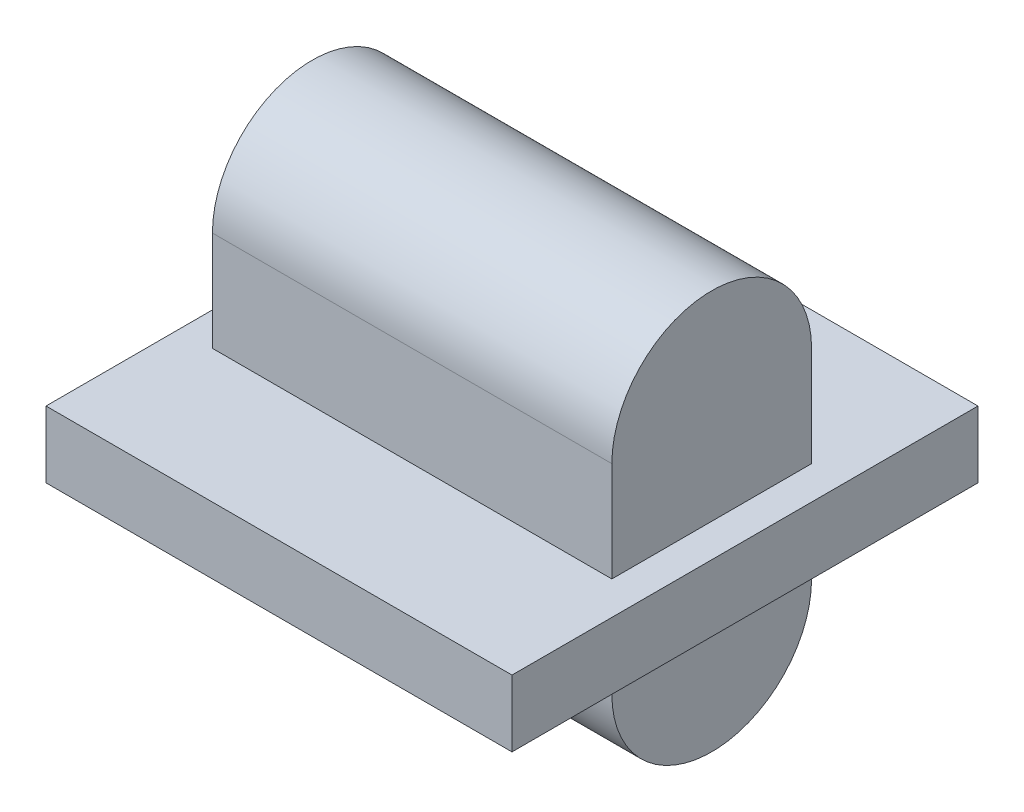
ISO-10303-21;
HEADER;
FILE_DESCRIPTION(('STEP AP214'),'2;1');
FILE_NAME('part.step','',(''),(''),'','','');
FILE_SCHEMA(('AUTOMOTIVE_DESIGN { 1 0 10303 214 1 1 1 1 }'));
ENDSEC;
DATA;
#1=APPLICATION_CONTEXT('core data for automotive mechanical design processes');
#2=APPLICATION_PROTOCOL_DEFINITION('international standard','automotive_design',2000,#1);
#3=PRODUCT_CONTEXT('',#1,'mechanical');
#4=PRODUCT('Part','Part','',(#3));
#5=PRODUCT_RELATED_PRODUCT_CATEGORY('part','',(#4));
#6=PRODUCT_DEFINITION_FORMATION('','',#4);
#7=PRODUCT_DEFINITION_CONTEXT('part definition',#1,'design');
#8=PRODUCT_DEFINITION('design','',#6,#7);
#9=PRODUCT_DEFINITION_SHAPE('','',#8);
#10=(LENGTH_UNIT() NAMED_UNIT(*) SI_UNIT(.MILLI.,.METRE.));
#11=(NAMED_UNIT(*) PLANE_ANGLE_UNIT() SI_UNIT($,.RADIAN.));
#12=(NAMED_UNIT(*) SI_UNIT($,.STERADIAN.) SOLID_ANGLE_UNIT());
#13=UNCERTAINTY_MEASURE_WITH_UNIT(LENGTH_MEASURE(1.E-05),#10,'distance_accuracy_value','');
#14=(GEOMETRIC_REPRESENTATION_CONTEXT(3) GLOBAL_UNCERTAINTY_ASSIGNED_CONTEXT((#13)) GLOBAL_UNIT_ASSIGNED_CONTEXT((#10,
#11,#12)) REPRESENTATION_CONTEXT('',''));
#15=CARTESIAN_POINT('',(0.,0.,0.));
#16=DIRECTION('',(0.,0.,1.));
#17=DIRECTION('',(1.,0.,0.));
#18=AXIS2_PLACEMENT_3D('',#15,#16,#17);
#19=CARTESIAN_POINT('',(-88.9000000000001,12.7,88.9));
#20=DIRECTION('',(1.,0.,0.));
#21=DIRECTION('',(0.,0.,-1.));
#22=AXIS2_PLACEMENT_3D('',#19,#20,#21);
#23=PLANE('',#22);
#24=DIRECTION('',(0.,0.,1.));
#25=VECTOR('',#24,1.);
#26=CARTESIAN_POINT('',(-88.9000000000001,-12.7,88.9));
#27=LINE('',#26,#25);
#28=CARTESIAN_POINT('',(-88.9000000000001,-12.7,-88.9));
#29=VERTEX_POINT('',#28);
#30=CARTESIAN_POINT('',(-88.9000000000001,-12.7,88.9));
#31=VERTEX_POINT('',#30);
#32=EDGE_CURVE('E163',#29,#31,#27,.T.);
#33=ORIENTED_EDGE('',*,*,#32,.T.);
#34=DIRECTION('',(0.,-1.,0.));
#35=VECTOR('',#34,1.);
#36=CARTESIAN_POINT('',(-88.9000000000001,12.7,88.9));
#37=LINE('',#36,#35);
#38=CARTESIAN_POINT('',(-88.9000000000001,12.7,88.9));
#39=VERTEX_POINT('',#38);
#40=EDGE_CURVE('E190',#39,#31,#37,.T.);
#41=ORIENTED_EDGE('',*,*,#40,.F.);
#42=DIRECTION('',(0.,0.,1.));
#43=VECTOR('',#42,1.);
#44=CARTESIAN_POINT('',(-88.9000000000001,12.7,88.9));
#45=LINE('',#44,#43);
#46=CARTESIAN_POINT('',(-88.9000000000001,12.7,-88.9));
#47=VERTEX_POINT('',#46);
#48=EDGE_CURVE('E164',#47,#39,#45,.T.);
#49=ORIENTED_EDGE('',*,*,#48,.F.);
#50=DIRECTION('',(0.,-1.,0.));
#51=VECTOR('',#50,1.);
#52=CARTESIAN_POINT('',(-88.9000000000001,12.7,-88.9));
#53=LINE('',#52,#51);
#54=EDGE_CURVE('E174',#47,#29,#53,.T.);
#55=ORIENTED_EDGE('',*,*,#54,.T.);
#56=EDGE_LOOP('',(#33,#41,#49,#55));
#57=FACE_BOUND('',#56,.T.);
#58=ADVANCED_FACE('F35',(#57),#23,.F.);
#59=CARTESIAN_POINT('',(88.8999999999999,12.7,88.8999999999999));
#60=DIRECTION('',(0.,0.,-1.));
#61=DIRECTION('',(-1.,0.,0.));
#62=AXIS2_PLACEMENT_3D('',#59,#60,#61);
#63=PLANE('',#62);
#64=DIRECTION('',(1.,0.,0.));
#65=VECTOR('',#64,1.);
#66=CARTESIAN_POINT('',(88.8999999999999,-12.7,88.8999999999999));
#67=LINE('',#66,#65);
#68=CARTESIAN_POINT('',(88.8999999999999,-12.7,88.8999999999999));
#69=VERTEX_POINT('',#68);
#70=EDGE_CURVE('E177',#31,#69,#67,.T.);
#71=ORIENTED_EDGE('',*,*,#70,.T.);
#72=DIRECTION('',(0.,-1.,0.));
#73=VECTOR('',#72,1.);
#74=CARTESIAN_POINT('',(88.8999999999999,12.7,88.8999999999999));
#75=LINE('',#74,#73);
#76=CARTESIAN_POINT('',(88.8999999999999,12.7,88.8999999999999));
#77=VERTEX_POINT('',#76);
#78=EDGE_CURVE('E187',#77,#69,#75,.T.);
#79=ORIENTED_EDGE('',*,*,#78,.F.);
#80=DIRECTION('',(1.,0.,0.));
#81=VECTOR('',#80,1.);
#82=CARTESIAN_POINT('',(88.8999999999999,12.7,88.8999999999999));
#83=LINE('',#82,#81);
#84=EDGE_CURVE('E167',#39,#77,#83,.T.);
#85=ORIENTED_EDGE('',*,*,#84,.F.);
#86=ORIENTED_EDGE('',*,*,#40,.T.);
#87=EDGE_LOOP('',(#71,#79,#85,#86));
#88=FACE_BOUND('',#87,.T.);
#89=ADVANCED_FACE('F246',(#88),#63,.F.);
#90=CARTESIAN_POINT('',(88.8999999999999,12.7,88.8999999999999));
#91=DIRECTION('',(-1.,0.,0.));
#92=DIRECTION('',(0.,0.,1.));
#93=AXIS2_PLACEMENT_3D('',#90,#91,#92);
#94=PLANE('',#93);
#95=DIRECTION('',(0.,0.,-1.));
#96=VECTOR('',#95,1.);
#97=CARTESIAN_POINT('',(88.8999999999999,-12.7,88.8999999999999));
#98=LINE('',#97,#96);
#99=CARTESIAN_POINT('',(88.8999999999999,-12.7,-88.9));
#100=VERTEX_POINT('',#99);
#101=EDGE_CURVE('E179',#69,#100,#98,.T.);
#102=ORIENTED_EDGE('',*,*,#101,.T.);
#103=DIRECTION('',(0.,-1.,0.));
#104=VECTOR('',#103,1.);
#105=CARTESIAN_POINT('',(88.8999999999999,12.7,-88.9));
#106=LINE('',#105,#104);
#107=CARTESIAN_POINT('',(88.8999999999999,12.7,-88.9));
#108=VERTEX_POINT('',#107);
#109=EDGE_CURVE('E184',#108,#100,#106,.T.);
#110=ORIENTED_EDGE('',*,*,#109,.F.);
#111=DIRECTION('',(0.,0.,-1.));
#112=VECTOR('',#111,1.);
#113=CARTESIAN_POINT('',(88.8999999999999,12.7,88.8999999999999));
#114=LINE('',#113,#112);
#115=EDGE_CURVE('E170',#77,#108,#114,.T.);
#116=ORIENTED_EDGE('',*,*,#115,.F.);
#117=ORIENTED_EDGE('',*,*,#78,.T.);
#118=EDGE_LOOP('',(#102,#110,#116,#117));
#119=FACE_BOUND('',#118,.T.);
#120=ADVANCED_FACE('F251',(#119),#94,.F.);
#121=CARTESIAN_POINT('',(88.8999999999999,12.7,-88.9));
#122=DIRECTION('',(0.,0.,1.));
#123=DIRECTION('',(1.,0.,0.));
#124=AXIS2_PLACEMENT_3D('',#121,#122,#123);
#125=PLANE('',#124);
#126=DIRECTION('',(-1.,0.,0.));
#127=VECTOR('',#126,1.);
#128=CARTESIAN_POINT('',(88.8999999999999,-12.7,-88.9));
#129=LINE('',#128,#127);
#130=EDGE_CURVE('E168',#100,#29,#129,.T.);
#131=ORIENTED_EDGE('',*,*,#130,.T.);
#132=ORIENTED_EDGE('',*,*,#54,.F.);
#133=DIRECTION('',(-1.,0.,0.));
#134=VECTOR('',#133,1.);
#135=CARTESIAN_POINT('',(88.8999999999999,12.7,-88.9));
#136=LINE('',#135,#134);
#137=EDGE_CURVE('E172',#108,#47,#136,.T.);
#138=ORIENTED_EDGE('',*,*,#137,.F.);
#139=ORIENTED_EDGE('',*,*,#109,.T.);
#140=EDGE_LOOP('',(#131,#132,#138,#139));
#141=FACE_BOUND('',#140,.T.);
#142=ADVANCED_FACE('F266',(#141),#125,.F.);
#143=CARTESIAN_POINT('',(0.,12.7,0.));
#144=DIRECTION('',(0.,1.,0.));
#145=DIRECTION('',(0.,0.,1.));
#146=AXIS2_PLACEMENT_3D('',#143,#144,#145);
#147=PLANE('',#146);
#148=DIRECTION('',(0.,0.,-1.));
#149=VECTOR('',#148,1.);
#150=CARTESIAN_POINT('',(76.2,12.7,0.));
#151=LINE('',#150,#149);
#152=CARTESIAN_POINT('',(76.2,12.7,38.1));
#153=VERTEX_POINT('',#152);
#154=CARTESIAN_POINT('',(76.2,12.7,-38.1));
#155=VERTEX_POINT('',#154);
#156=EDGE_CURVE('E149',#153,#155,#151,.T.);
#157=ORIENTED_EDGE('',*,*,#156,.F.);
#158=DIRECTION('',(-1.,0.,0.));
#159=VECTOR('',#158,1.);
#160=CARTESIAN_POINT('',(0.,12.7,38.1));
#161=LINE('',#160,#159);
#162=CARTESIAN_POINT('',(-76.2,12.7,38.1));
#163=VERTEX_POINT('',#162);
#164=EDGE_CURVE('E157',#153,#163,#161,.T.);
#165=ORIENTED_EDGE('',*,*,#164,.T.);
#166=DIRECTION('',(0.,0.,-1.));
#167=VECTOR('',#166,1.);
#168=CARTESIAN_POINT('',(-76.2,12.7,0.));
#169=LINE('',#168,#167);
#170=CARTESIAN_POINT('',(-76.2,12.7,-38.1));
#171=VERTEX_POINT('',#170);
#172=EDGE_CURVE('E145',#163,#171,#169,.T.);
#173=ORIENTED_EDGE('',*,*,#172,.T.);
#174=DIRECTION('',(1.,0.,0.));
#175=VECTOR('',#174,1.);
#176=CARTESIAN_POINT('',(0.,12.7,-38.1));
#177=LINE('',#176,#175);
#178=EDGE_CURVE('E160',#171,#155,#177,.T.);
#179=ORIENTED_EDGE('',*,*,#178,.T.);
#180=EDGE_LOOP('',(#157,#165,#173,#179));
#181=FACE_BOUND('',#180,.T.);
#182=ORIENTED_EDGE('',*,*,#48,.T.);
#183=ORIENTED_EDGE('',*,*,#84,.T.);
#184=ORIENTED_EDGE('',*,*,#115,.T.);
#185=ORIENTED_EDGE('',*,*,#137,.T.);
#186=EDGE_LOOP('',(#182,#183,#184,#185));
#187=FACE_BOUND('',#186,.T.);
#188=ADVANCED_FACE('F225',(#181,#187),#147,.T.);
#189=CARTESIAN_POINT('',(0.,-12.7,0.));
#190=DIRECTION('',(0.,1.,0.));
#191=DIRECTION('',(0.,0.,1.));
#192=AXIS2_PLACEMENT_3D('',#189,#190,#191);
#193=PLANE('',#192);
#194=DIRECTION('',(-1.,0.,0.));
#195=VECTOR('',#194,1.);
#196=CARTESIAN_POINT('',(0.,-12.7,38.1));
#197=LINE('',#196,#195);
#198=CARTESIAN_POINT('',(76.2,-12.7,38.1));
#199=VERTEX_POINT('',#198);
#200=CARTESIAN_POINT('',(-76.2,-12.7,38.1));
#201=VERTEX_POINT('',#200);
#202=EDGE_CURVE('E196',#199,#201,#197,.T.);
#203=ORIENTED_EDGE('',*,*,#202,.F.);
#204=DIRECTION('',(0.,0.,-1.));
#205=VECTOR('',#204,1.);
#206=CARTESIAN_POINT('',(76.2,-12.7,0.));
#207=LINE('',#206,#205);
#208=CARTESIAN_POINT('',(76.2,-12.7,-38.1));
#209=VERTEX_POINT('',#208);
#210=EDGE_CURVE('E11',#199,#209,#207,.T.);
#211=ORIENTED_EDGE('',*,*,#210,.T.);
#212=DIRECTION('',(1.,0.,0.));
#213=VECTOR('',#212,1.);
#214=CARTESIAN_POINT('',(0.,-12.7,-38.1));
#215=LINE('',#214,#213);
#216=CARTESIAN_POINT('',(-76.2,-12.7,-38.1));
#217=VERTEX_POINT('',#216);
#218=EDGE_CURVE('E42',#217,#209,#215,.T.);
#219=ORIENTED_EDGE('',*,*,#218,.F.);
#220=DIRECTION('',(0.,0.,-1.));
#221=VECTOR('',#220,1.);
#222=CARTESIAN_POINT('',(-76.2,-12.7,0.));
#223=LINE('',#222,#221);
#224=EDGE_CURVE('E193',#201,#217,#223,.T.);
#225=ORIENTED_EDGE('',*,*,#224,.F.);
#226=EDGE_LOOP('',(#203,#211,#219,#225));
#227=FACE_BOUND('',#226,.T.);
#228=ORIENTED_EDGE('',*,*,#32,.F.);
#229=ORIENTED_EDGE('',*,*,#130,.F.);
#230=ORIENTED_EDGE('',*,*,#101,.F.);
#231=ORIENTED_EDGE('',*,*,#70,.F.);
#232=EDGE_LOOP('',(#228,#229,#230,#231));
#233=FACE_BOUND('',#232,.T.);
#234=ADVANCED_FACE('F259',(#227,#233),#193,.F.);
#235=CARTESIAN_POINT('',(76.2,-25.4,0.));
#236=DIRECTION('',(-1.,0.,0.));
#237=DIRECTION('',(0.,0.,1.));
#238=AXIS2_PLACEMENT_3D('',#235,#236,#237);
#239=CYLINDRICAL_SURFACE('',#238,38.1);
#240=CARTESIAN_POINT('',(-76.2,-25.4,0.));
#241=DIRECTION('',(1.,0.,0.));
#242=DIRECTION('',(0.,0.,-1.));
#243=AXIS2_PLACEMENT_3D('',#240,#241,#242);
#244=CIRCLE('',#243,38.1);
#245=CARTESIAN_POINT('',(-76.2,-25.4,38.1));
#246=VERTEX_POINT('',#245);
#247=CARTESIAN_POINT('',(-76.2,-25.4,-38.1));
#248=VERTEX_POINT('',#247);
#249=EDGE_CURVE('E144',#246,#248,#244,.T.);
#250=ORIENTED_EDGE('',*,*,#249,.T.);
#251=DIRECTION('',(-1.,0.,0.));
#252=VECTOR('',#251,1.);
#253=CARTESIAN_POINT('',(76.2,-25.4,-38.1));
#254=LINE('',#253,#252);
#255=CARTESIAN_POINT('',(76.2,-25.4,-38.1));
#256=VERTEX_POINT('',#255);
#257=EDGE_CURVE('E126',#256,#248,#254,.T.);
#258=ORIENTED_EDGE('',*,*,#257,.F.);
#259=CARTESIAN_POINT('',(76.2,-25.4,0.));
#260=DIRECTION('',(1.,0.,0.));
#261=DIRECTION('',(0.,0.,-1.));
#262=AXIS2_PLACEMENT_3D('',#259,#260,#261);
#263=CIRCLE('',#262,38.1);
#264=CARTESIAN_POINT('',(76.2,-25.4,38.1));
#265=VERTEX_POINT('',#264);
#266=EDGE_CURVE('E133',#265,#256,#263,.T.);
#267=ORIENTED_EDGE('',*,*,#266,.F.);
#268=DIRECTION('',(-1.,0.,0.));
#269=VECTOR('',#268,1.);
#270=CARTESIAN_POINT('',(76.2,-25.4,38.1));
#271=LINE('',#270,#269);
#272=EDGE_CURVE('E211',#265,#246,#271,.T.);
#273=ORIENTED_EDGE('',*,*,#272,.T.);
#274=EDGE_LOOP('',(#250,#258,#267,#273));
#275=FACE_BOUND('',#274,.T.);
#276=ADVANCED_FACE('F142',(#275),#239,.T.);
#277=CARTESIAN_POINT('',(-76.2,-25.4,0.));
#278=DIRECTION('',(1.,0.,0.));
#279=DIRECTION('',(0.,0.,-1.));
#280=AXIS2_PLACEMENT_3D('',#277,#278,#279);
#281=PLANE('',#280);
#282=DIRECTION('',(0.,-1.,0.));
#283=VECTOR('',#282,1.);
#284=CARTESIAN_POINT('',(-76.2,-25.4,38.1));
#285=LINE('',#284,#283);
#286=EDGE_CURVE('E201',#201,#246,#285,.T.);
#287=ORIENTED_EDGE('',*,*,#286,.F.);
#288=ORIENTED_EDGE('',*,*,#224,.T.);
#289=DIRECTION('',(0.,1.,0.));
#290=VECTOR('',#289,1.);
#291=CARTESIAN_POINT('',(-76.2,-25.4,-38.1));
#292=LINE('',#291,#290);
#293=EDGE_CURVE('E207',#248,#217,#292,.T.);
#294=ORIENTED_EDGE('',*,*,#293,.F.);
#295=ORIENTED_EDGE('',*,*,#249,.F.);
#296=EDGE_LOOP('',(#287,#288,#294,#295));
#297=FACE_BOUND('',#296,.T.);
#298=ADVANCED_FACE('F203',(#297),#281,.F.);
#299=CARTESIAN_POINT('',(76.2,-25.4,0.));
#300=DIRECTION('',(1.,0.,0.));
#301=DIRECTION('',(0.,0.,-1.));
#302=AXIS2_PLACEMENT_3D('',#299,#300,#301);
#303=PLANE('',#302);
#304=ORIENTED_EDGE('',*,*,#210,.F.);
#305=DIRECTION('',(0.,-1.,0.));
#306=VECTOR('',#305,1.);
#307=CARTESIAN_POINT('',(76.2,-25.4,38.1));
#308=LINE('',#307,#306);
#309=EDGE_CURVE('E136',#199,#265,#308,.T.);
#310=ORIENTED_EDGE('',*,*,#309,.T.);
#311=ORIENTED_EDGE('',*,*,#266,.T.);
#312=DIRECTION('',(0.,1.,0.));
#313=VECTOR('',#312,1.);
#314=CARTESIAN_POINT('',(76.2,-25.4,-38.1));
#315=LINE('',#314,#313);
#316=EDGE_CURVE('E121',#256,#209,#315,.T.);
#317=ORIENTED_EDGE('',*,*,#316,.T.);
#318=EDGE_LOOP('',(#304,#310,#311,#317));
#319=FACE_BOUND('',#318,.T.);
#320=ADVANCED_FACE('F134',(#319),#303,.T.);
#321=CARTESIAN_POINT('',(76.2,-25.4,38.1));
#322=DIRECTION('',(0.,0.,-1.));
#323=DIRECTION('',(-1.,0.,0.));
#324=AXIS2_PLACEMENT_3D('',#321,#322,#323);
#325=PLANE('',#324);
#326=ORIENTED_EDGE('',*,*,#309,.F.);
#327=ORIENTED_EDGE('',*,*,#202,.T.);
#328=ORIENTED_EDGE('',*,*,#286,.T.);
#329=ORIENTED_EDGE('',*,*,#272,.F.);
#330=EDGE_LOOP('',(#326,#327,#328,#329));
#331=FACE_BOUND('',#330,.T.);
#332=ADVANCED_FACE('F200',(#331),#325,.F.);
#333=CARTESIAN_POINT('',(76.2,-25.4,-38.1));
#334=DIRECTION('',(0.,0.,1.));
#335=DIRECTION('',(1.,0.,0.));
#336=AXIS2_PLACEMENT_3D('',#333,#334,#335);
#337=PLANE('',#336);
#338=ORIENTED_EDGE('',*,*,#293,.T.);
#339=ORIENTED_EDGE('',*,*,#218,.T.);
#340=ORIENTED_EDGE('',*,*,#316,.F.);
#341=ORIENTED_EDGE('',*,*,#257,.T.);
#342=EDGE_LOOP('',(#338,#339,#340,#341));
#343=FACE_BOUND('',#342,.T.);
#344=ADVANCED_FACE('F124',(#343),#337,.F.);
#345=ORIENTED_EDGE('',*,*,#178,.F.);
#346=CARTESIAN_POINT('',(-76.2,50.8,-38.1));
#347=VERTEX_POINT('',#346);
#348=EDGE_CURVE('E49',#171,#347,#292,.T.);
#349=ORIENTED_EDGE('',*,*,#348,.T.);
#350=DIRECTION('',(-1.,0.,0.));
#351=VECTOR('',#350,1.);
#352=CARTESIAN_POINT('',(76.2,50.8,-38.1));
#353=LINE('',#352,#351);
#354=CARTESIAN_POINT('',(76.2,50.8,-38.1));
#355=VERTEX_POINT('',#354);
#356=EDGE_CURVE('E146',#355,#347,#353,.T.);
#357=ORIENTED_EDGE('',*,*,#356,.F.);
#358=EDGE_CURVE('E130',#155,#355,#315,.T.);
#359=ORIENTED_EDGE('',*,*,#358,.F.);
#360=EDGE_LOOP('',(#345,#349,#357,#359));
#361=FACE_BOUND('',#360,.T.);
#362=ADVANCED_FACE('F235',(#361),#337,.F.);
#363=CARTESIAN_POINT('',(76.2,50.8,0.));
#364=DIRECTION('',(-1.,0.,0.));
#365=DIRECTION('',(0.,0.,1.));
#366=AXIS2_PLACEMENT_3D('',#363,#364,#365);
#367=CYLINDRICAL_SURFACE('',#366,38.1);
#368=CARTESIAN_POINT('',(-76.2,50.8,0.));
#369=DIRECTION('',(1.,0.,0.));
#370=DIRECTION('',(0.,0.,-1.));
#371=AXIS2_PLACEMENT_3D('',#368,#369,#370);
#372=CIRCLE('',#371,38.1);
#373=CARTESIAN_POINT('',(-76.2,50.8,38.1));
#374=VERTEX_POINT('',#373);
#375=EDGE_CURVE('E204',#347,#374,#372,.T.);
#376=ORIENTED_EDGE('',*,*,#375,.T.);
#377=DIRECTION('',(-1.,0.,0.));
#378=VECTOR('',#377,1.);
#379=CARTESIAN_POINT('',(76.2,50.8,38.1));
#380=LINE('',#379,#378);
#381=CARTESIAN_POINT('',(76.2,50.8,38.1));
#382=VERTEX_POINT('',#381);
#383=EDGE_CURVE('E152',#382,#374,#380,.T.);
#384=ORIENTED_EDGE('',*,*,#383,.F.);
#385=CARTESIAN_POINT('',(76.2,50.8,0.));
#386=DIRECTION('',(1.,0.,0.));
#387=DIRECTION('',(0.,0.,-1.));
#388=AXIS2_PLACEMENT_3D('',#385,#386,#387);
#389=CIRCLE('',#388,38.1);
#390=EDGE_CURVE('E129',#355,#382,#389,.T.);
#391=ORIENTED_EDGE('',*,*,#390,.F.);
#392=ORIENTED_EDGE('',*,*,#356,.T.);
#393=EDGE_LOOP('',(#376,#384,#391,#392));
#394=FACE_BOUND('',#393,.T.);
#395=ADVANCED_FACE('F236',(#394),#367,.T.);
#396=ORIENTED_EDGE('',*,*,#164,.F.);
#397=EDGE_CURVE('E212',#382,#153,#308,.T.);
#398=ORIENTED_EDGE('',*,*,#397,.F.);
#399=ORIENTED_EDGE('',*,*,#383,.T.);
#400=EDGE_CURVE('E140',#374,#163,#285,.T.);
#401=ORIENTED_EDGE('',*,*,#400,.T.);
#402=EDGE_LOOP('',(#396,#398,#399,#401));
#403=FACE_BOUND('',#402,.T.);
#404=ADVANCED_FACE('F218',(#403),#325,.F.);
#405=ORIENTED_EDGE('',*,*,#397,.T.);
#406=ORIENTED_EDGE('',*,*,#156,.T.);
#407=ORIENTED_EDGE('',*,*,#358,.T.);
#408=ORIENTED_EDGE('',*,*,#390,.T.);
#409=EDGE_LOOP('',(#405,#406,#407,#408));
#410=FACE_BOUND('',#409,.T.);
#411=ADVANCED_FACE('F228',(#410),#303,.T.);
#412=ORIENTED_EDGE('',*,*,#172,.F.);
#413=ORIENTED_EDGE('',*,*,#400,.F.);
#414=ORIENTED_EDGE('',*,*,#375,.F.);
#415=ORIENTED_EDGE('',*,*,#348,.F.);
#416=EDGE_LOOP('',(#412,#413,#414,#415));
#417=FACE_BOUND('',#416,.T.);
#418=ADVANCED_FACE('F222',(#417),#281,.F.);
#419=CLOSED_SHELL('',(#58,#89,#120,#142,#188,#234,#276,#298,#320,#332,#344,#362,#395,#404,#411,#418));
#420=MANIFOLD_SOLID_BREP('B2',#419);
#421=ADVANCED_BREP_SHAPE_REPRESENTATION('',(#18,#420),#14);
#422=SHAPE_DEFINITION_REPRESENTATION(#9,#421);
ENDSEC;
END-ISO-10303-21;
